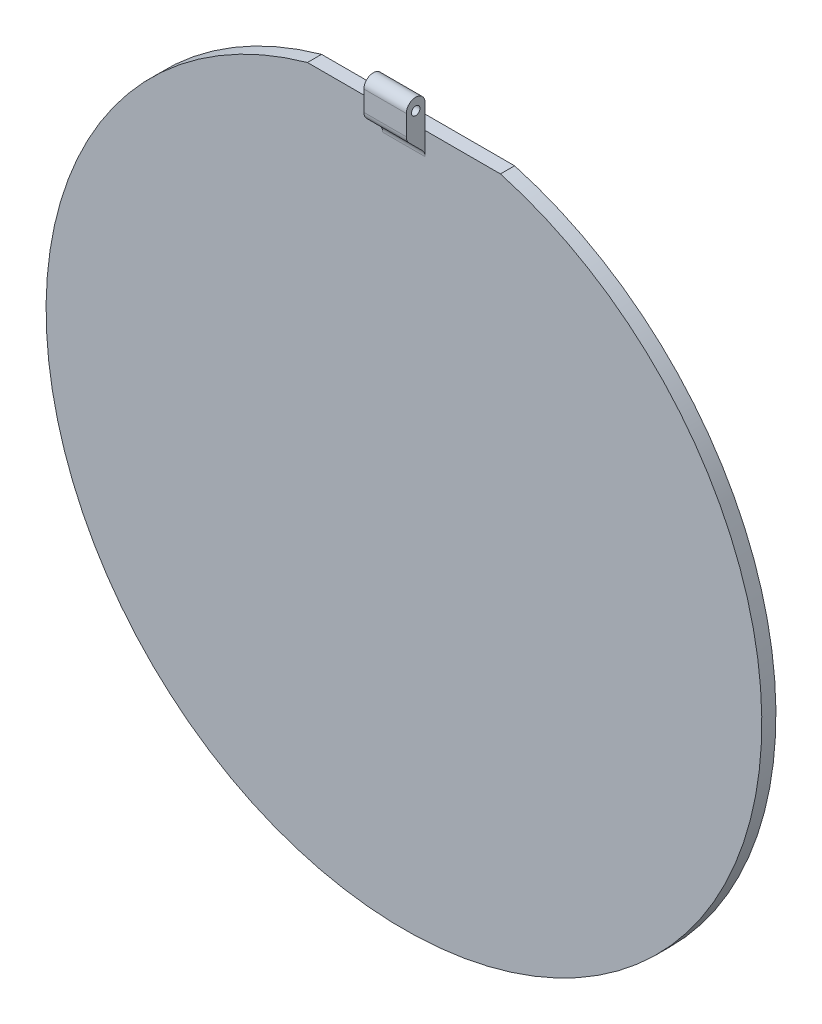
ISO-10303-21;
HEADER;
FILE_DESCRIPTION(('STEP AP214'),'2;1');
FILE_NAME('part.step','',(''),(''),'','','');
FILE_SCHEMA(('AUTOMOTIVE_DESIGN { 1 0 10303 214 1 1 1 1 }'));
ENDSEC;
DATA;
#1=APPLICATION_CONTEXT('core data for automotive mechanical design processes');
#2=APPLICATION_PROTOCOL_DEFINITION('international standard','automotive_design',2000,#1);
#3=PRODUCT_CONTEXT('',#1,'mechanical');
#4=PRODUCT('Part','Part','',(#3));
#5=PRODUCT_RELATED_PRODUCT_CATEGORY('part','',(#4));
#6=PRODUCT_DEFINITION_FORMATION('','',#4);
#7=PRODUCT_DEFINITION_CONTEXT('part definition',#1,'design');
#8=PRODUCT_DEFINITION('design','',#6,#7);
#9=PRODUCT_DEFINITION_SHAPE('','',#8);
#10=(LENGTH_UNIT() NAMED_UNIT(*) SI_UNIT(.MILLI.,.METRE.));
#11=(NAMED_UNIT(*) PLANE_ANGLE_UNIT() SI_UNIT($,.RADIAN.));
#12=(NAMED_UNIT(*) SI_UNIT($,.STERADIAN.) SOLID_ANGLE_UNIT());
#13=UNCERTAINTY_MEASURE_WITH_UNIT(LENGTH_MEASURE(1.E-05),#10,'distance_accuracy_value','');
#14=(GEOMETRIC_REPRESENTATION_CONTEXT(3) GLOBAL_UNCERTAINTY_ASSIGNED_CONTEXT((#13)) GLOBAL_UNIT_ASSIGNED_CONTEXT((#10,
#11,#12)) REPRESENTATION_CONTEXT('',''));
#15=CARTESIAN_POINT('',(0.,0.,0.));
#16=DIRECTION('',(0.,0.,1.));
#17=DIRECTION('',(1.,0.,0.));
#18=AXIS2_PLACEMENT_3D('',#15,#16,#17);
#19=CARTESIAN_POINT('',(2.25,39.1513595204169,2.5));
#20=DIRECTION('',(-1.,0.,0.));
#21=DIRECTION('',(0.,-1.,0.));
#22=AXIS2_PLACEMENT_3D('',#19,#20,#21);
#23=CYLINDRICAL_SURFACE('',#22,0.999999999999997);
#24=DIRECTION('',(1.,0.,0.));
#25=VECTOR('',#24,1.);
#26=CARTESIAN_POINT('',(2.25,39.1513595204169,3.5));
#27=LINE('',#26,#25);
#28=CARTESIAN_POINT('',(2.25,39.1513595204169,3.5));
#29=VERTEX_POINT('',#28);
#30=CARTESIAN_POINT('',(-2.25,39.1513595204169,3.5));
#31=VERTEX_POINT('',#30);
#32=EDGE_CURVE('E161',#29,#31,#27,.F.);
#33=ORIENTED_EDGE('',*,*,#32,.F.);
#34=CARTESIAN_POINT('',(2.25,39.1513595204169,2.5));
#35=DIRECTION('',(-1.,0.,0.));
#36=DIRECTION('',(0.,0.,1.));
#37=AXIS2_PLACEMENT_3D('',#34,#35,#36);
#38=CIRCLE('',#37,0.999999999999997);
#39=CARTESIAN_POINT('',(2.25,39.1513595204169,1.5));
#40=VERTEX_POINT('',#39);
#41=EDGE_CURVE('E167',#40,#29,#38,.F.);
#42=ORIENTED_EDGE('',*,*,#41,.F.);
#43=DIRECTION('',(-1.,0.,0.));
#44=VECTOR('',#43,1.);
#45=CARTESIAN_POINT('',(2.25,39.1513595204169,1.5));
#46=LINE('',#45,#44);
#47=CARTESIAN_POINT('',(-2.25,39.1513595204169,1.5));
#48=VERTEX_POINT('',#47);
#49=EDGE_CURVE('E116',#48,#40,#46,.F.);
#50=ORIENTED_EDGE('',*,*,#49,.F.);
#51=CARTESIAN_POINT('',(-2.25,39.1513595204169,2.5));
#52=DIRECTION('',(1.,0.,0.));
#53=DIRECTION('',(0.,1.,0.));
#54=AXIS2_PLACEMENT_3D('',#51,#52,#53);
#55=CIRCLE('',#54,0.999999999999997);
#56=EDGE_CURVE('E169',#31,#48,#55,.F.);
#57=ORIENTED_EDGE('',*,*,#56,.F.);
#58=EDGE_LOOP('',(#33,#42,#50,#57));
#59=FACE_BOUND('',#58,.T.);
#60=ADVANCED_FACE('F35',(#59),#23,.T.);
#61=CARTESIAN_POINT('',(-10.2470158263746,36.592330708142,-0.000999999999999916));
#62=DIRECTION('',(0.,-1.,0.));
#63=DIRECTION('',(0.,0.,-1.));
#64=AXIS2_PLACEMENT_3D('',#61,#62,#63);
#65=PLANE('',#64);
#66=DIRECTION('',(-1.,0.,0.));
#67=VECTOR('',#66,1.);
#68=CARTESIAN_POINT('',(2.25,36.592330708142,1.5));
#69=LINE('',#68,#67);
#70=CARTESIAN_POINT('',(2.25,36.592330708142,1.5));
#71=VERTEX_POINT('',#70);
#72=CARTESIAN_POINT('',(-2.25,36.592330708142,1.5));
#73=VERTEX_POINT('',#72);
#74=EDGE_CURVE('E113',#71,#73,#69,.T.);
#75=ORIENTED_EDGE('',*,*,#74,.F.);
#76=DIRECTION('',(1.,0.,0.));
#77=VECTOR('',#76,1.);
#78=CARTESIAN_POINT('',(-10.2470158263746,36.592330708142,1.5));
#79=LINE('',#78,#77);
#80=CARTESIAN_POINT('',(10.2470158263746,36.592330708142,1.5));
#81=VERTEX_POINT('',#80);
#82=EDGE_CURVE('E127',#71,#81,#79,.T.);
#83=ORIENTED_EDGE('',*,*,#82,.T.);
#84=DIRECTION('',(0.,0.,1.));
#85=VECTOR('',#84,1.);
#86=CARTESIAN_POINT('',(10.2470158263746,36.592330708142,-0.000999999999999916));
#87=LINE('',#86,#85);
#88=CARTESIAN_POINT('',(10.2470158263746,36.592330708142,0.));
#89=VERTEX_POINT('',#88);
#90=EDGE_CURVE('E154',#89,#81,#87,.T.);
#91=ORIENTED_EDGE('',*,*,#90,.F.);
#92=DIRECTION('',(-1.,0.,0.));
#93=VECTOR('',#92,1.);
#94=CARTESIAN_POINT('',(-10.2470158263746,36.592330708142,0.));
#95=LINE('',#94,#93);
#96=CARTESIAN_POINT('',(-10.2470158263746,36.592330708142,0.));
#97=VERTEX_POINT('',#96);
#98=EDGE_CURVE('E156',#89,#97,#95,.T.);
#99=ORIENTED_EDGE('',*,*,#98,.T.);
#100=DIRECTION('',(0.,0.,1.));
#101=VECTOR('',#100,1.);
#102=CARTESIAN_POINT('',(-10.2470158263746,36.592330708142,-0.000999999999999916));
#103=LINE('',#102,#101);
#104=CARTESIAN_POINT('',(-10.2470158263746,36.592330708142,1.5));
#105=VERTEX_POINT('',#104);
#106=EDGE_CURVE('E153',#97,#105,#103,.T.);
#107=ORIENTED_EDGE('',*,*,#106,.T.);
#108=EDGE_CURVE('E130',#105,#73,#79,.T.);
#109=ORIENTED_EDGE('',*,*,#108,.T.);
#110=EDGE_LOOP('',(#75,#83,#91,#99,#107,#109));
#111=FACE_BOUND('',#110,.T.);
#112=ADVANCED_FACE('F126',(#111),#65,.F.);
#113=CARTESIAN_POINT('',(0.,0.,1.5));
#114=DIRECTION('',(0.,0.,-1.));
#115=DIRECTION('',(-1.,0.,0.));
#116=AXIS2_PLACEMENT_3D('',#113,#114,#115);
#117=CYLINDRICAL_SURFACE('',#116,38.);
#118=CARTESIAN_POINT('',(0.,0.,1.5));
#119=DIRECTION('',(0.,0.,1.));
#120=DIRECTION('',(1.,0.,0.));
#121=AXIS2_PLACEMENT_3D('',#118,#119,#120);
#122=CIRCLE('',#121,38.);
#123=EDGE_CURVE('E139',#105,#81,#122,.T.);
#124=ORIENTED_EDGE('',*,*,#123,.F.);
#125=ORIENTED_EDGE('',*,*,#106,.F.);
#126=CARTESIAN_POINT('',(0.,0.,0.));
#127=DIRECTION('',(0.,0.,1.));
#128=DIRECTION('',(1.,0.,0.));
#129=AXIS2_PLACEMENT_3D('',#126,#127,#128);
#130=CIRCLE('',#129,38.);
#131=EDGE_CURVE('E159',#97,#89,#130,.T.);
#132=ORIENTED_EDGE('',*,*,#131,.T.);
#133=ORIENTED_EDGE('',*,*,#90,.T.);
#134=EDGE_LOOP('',(#124,#125,#132,#133));
#135=FACE_BOUND('',#134,.T.);
#136=ADVANCED_FACE('F216',(#135),#117,.T.);
#137=CARTESIAN_POINT('',(0.,0.,1.5));
#138=DIRECTION('',(0.,0.,1.));
#139=DIRECTION('',(1.,0.,0.));
#140=AXIS2_PLACEMENT_3D('',#137,#138,#139);
#141=PLANE('',#140);
#142=DIRECTION('',(0.,1.,0.));
#143=VECTOR('',#142,1.);
#144=CARTESIAN_POINT('',(2.25,36.592330708142,1.5));
#145=LINE('',#144,#143);
#146=CARTESIAN_POINT('',(2.25,34.1781171457689,1.5));
#147=VERTEX_POINT('',#146);
#148=EDGE_CURVE('E120',#147,#71,#145,.T.);
#149=ORIENTED_EDGE('',*,*,#148,.F.);
#150=DIRECTION('',(1.,0.,0.));
#151=VECTOR('',#150,1.);
#152=CARTESIAN_POINT('',(-2.25,34.1781171457689,1.5));
#153=LINE('',#152,#151);
#154=CARTESIAN_POINT('',(-2.25,34.1781171457689,1.5));
#155=VERTEX_POINT('',#154);
#156=EDGE_CURVE('E180',#147,#155,#153,.F.);
#157=ORIENTED_EDGE('',*,*,#156,.T.);
#158=DIRECTION('',(0.,-1.,0.));
#159=VECTOR('',#158,1.);
#160=CARTESIAN_POINT('',(-2.25,36.592330708142,1.5));
#161=LINE('',#160,#159);
#162=EDGE_CURVE('E146',#73,#155,#161,.T.);
#163=ORIENTED_EDGE('',*,*,#162,.F.);
#164=ORIENTED_EDGE('',*,*,#108,.F.);
#165=ORIENTED_EDGE('',*,*,#123,.T.);
#166=ORIENTED_EDGE('',*,*,#82,.F.);
#167=EDGE_LOOP('',(#149,#157,#163,#164,#165,#166));
#168=FACE_BOUND('',#167,.T.);
#169=ADVANCED_FACE('F135',(#168),#141,.T.);
#170=CARTESIAN_POINT('',(0.,0.,0.));
#171=DIRECTION('',(0.,0.,1.));
#172=DIRECTION('',(1.,0.,0.));
#173=AXIS2_PLACEMENT_3D('',#170,#171,#172);
#174=PLANE('',#173);
#175=ORIENTED_EDGE('',*,*,#131,.F.);
#176=ORIENTED_EDGE('',*,*,#98,.F.);
#177=EDGE_LOOP('',(#175,#176));
#178=FACE_BOUND('',#177,.T.);
#179=ADVANCED_FACE('F244',(#178),#174,.F.);
#180=CARTESIAN_POINT('',(2.25,36.592330708142,3.5));
#181=DIRECTION('',(-1.,0.,0.));
#182=DIRECTION('',(0.,0.,1.));
#183=AXIS2_PLACEMENT_3D('',#180,#181,#182);
#184=PLANE('',#183);
#185=CARTESIAN_POINT('',(2.25,38.8994820640522,2.5));
#186=DIRECTION('',(-1.,0.,0.));
#187=DIRECTION('',(0.,0.,1.));
#188=AXIS2_PLACEMENT_3D('',#185,#186,#187);
#189=CIRCLE('',#188,0.449999999999992);
#190=CARTESIAN_POINT('',(2.25,38.8994820640522,2.94999999999999));
#191=VERTEX_POINT('',#190);
#192=EDGE_CURVE('E131',#191,#191,#189,.T.);
#193=ORIENTED_EDGE('',*,*,#192,.T.);
#194=EDGE_LOOP('',(#193));
#195=FACE_BOUND('',#194,.T.);
#196=DIRECTION('',(0.,1.,0.));
#197=VECTOR('',#196,1.);
#198=CARTESIAN_POINT('',(2.25,36.592330708142,3.5));
#199=LINE('',#198,#197);
#200=CARTESIAN_POINT('',(2.25,37.0065442705151,3.5));
#201=VERTEX_POINT('',#200);
#202=EDGE_CURVE('E148',#201,#29,#199,.T.);
#203=ORIENTED_EDGE('',*,*,#202,.F.);
#204=CARTESIAN_POINT('',(2.25,37.0065442705151,2.5));
#205=DIRECTION('',(-1.,0.,0.));
#206=DIRECTION('',(0.,0.,1.));
#207=AXIS2_PLACEMENT_3D('',#204,#205,#206);
#208=CIRCLE('',#207,1.);
#209=CARTESIAN_POINT('',(2.25,36.2994374893285,3.20710678118655));
#210=VERTEX_POINT('',#209);
#211=EDGE_CURVE('E50',#201,#210,#208,.F.);
#212=ORIENTED_EDGE('',*,*,#211,.T.);
#213=DIRECTION('',(0.,-0.707106781186545,-0.70710678118655));
#214=VECTOR('',#213,1.);
#215=CARTESIAN_POINT('',(2.25,36.5923307081419,3.5));
#216=LINE('',#215,#214);
#217=CARTESIAN_POINT('',(2.25,34.8852239269554,1.79289321881346));
#218=VERTEX_POINT('',#217);
#219=EDGE_CURVE('E171',#210,#218,#216,.T.);
#220=ORIENTED_EDGE('',*,*,#219,.T.);
#221=CARTESIAN_POINT('',(2.25,34.1781171457689,2.5));
#222=DIRECTION('',(-1.,0.,0.));
#223=DIRECTION('',(0.,0.,1.));
#224=AXIS2_PLACEMENT_3D('',#221,#222,#223);
#225=CIRCLE('',#224,1.);
#226=EDGE_CURVE('E43',#218,#147,#225,.T.);
#227=ORIENTED_EDGE('',*,*,#226,.T.);
#228=ORIENTED_EDGE('',*,*,#148,.T.);
#229=DIRECTION('',(0.,-1.,0.));
#230=VECTOR('',#229,1.);
#231=CARTESIAN_POINT('',(2.25,45.1017890475389,1.5));
#232=LINE('',#231,#230);
#233=EDGE_CURVE('E109',#40,#71,#232,.T.);
#234=ORIENTED_EDGE('',*,*,#233,.F.);
#235=ORIENTED_EDGE('',*,*,#41,.T.);
#236=EDGE_LOOP('',(#203,#212,#220,#227,#228,#234,#235));
#237=FACE_BOUND('',#236,.T.);
#238=ADVANCED_FACE('F143',(#195,#237),#184,.F.);
#239=CARTESIAN_POINT('',(-2.25,36.592330708142,3.5));
#240=DIRECTION('',(1.,0.,0.));
#241=DIRECTION('',(0.,1.,0.));
#242=AXIS2_PLACEMENT_3D('',#239,#240,#241);
#243=PLANE('',#242);
#244=CARTESIAN_POINT('',(-2.25,38.8994820640522,2.5));
#245=DIRECTION('',(-1.,0.,0.));
#246=DIRECTION('',(0.,0.,1.));
#247=AXIS2_PLACEMENT_3D('',#244,#245,#246);
#248=CIRCLE('',#247,0.449999999999992);
#249=CARTESIAN_POINT('',(-2.25,38.8994820640522,2.94999999999999));
#250=VERTEX_POINT('',#249);
#251=EDGE_CURVE('E197',#250,#250,#248,.T.);
#252=ORIENTED_EDGE('',*,*,#251,.F.);
#253=EDGE_LOOP('',(#252));
#254=FACE_BOUND('',#253,.T.);
#255=DIRECTION('',(0.,0.707106781186545,0.70710678118655));
#256=VECTOR('',#255,1.);
#257=CARTESIAN_POINT('',(-2.25,36.5923307081419,3.5));
#258=LINE('',#257,#256);
#259=CARTESIAN_POINT('',(-2.25,34.8852239269554,1.79289321881346));
#260=VERTEX_POINT('',#259);
#261=CARTESIAN_POINT('',(-2.25,36.2994374893285,3.20710678118655));
#262=VERTEX_POINT('',#261);
#263=EDGE_CURVE('E173',#260,#262,#258,.T.);
#264=ORIENTED_EDGE('',*,*,#263,.T.);
#265=CARTESIAN_POINT('',(-2.25,37.0065442705151,2.5));
#266=DIRECTION('',(1.,0.,0.));
#267=DIRECTION('',(0.,1.,0.));
#268=AXIS2_PLACEMENT_3D('',#265,#266,#267);
#269=CIRCLE('',#268,1.);
#270=CARTESIAN_POINT('',(-2.25,37.0065442705151,3.5));
#271=VERTEX_POINT('',#270);
#272=EDGE_CURVE('E58',#262,#271,#269,.F.);
#273=ORIENTED_EDGE('',*,*,#272,.T.);
#274=DIRECTION('',(0.,-1.,0.));
#275=VECTOR('',#274,1.);
#276=CARTESIAN_POINT('',(-2.25,36.592330708142,3.5));
#277=LINE('',#276,#275);
#278=EDGE_CURVE('E140',#31,#271,#277,.T.);
#279=ORIENTED_EDGE('',*,*,#278,.F.);
#280=ORIENTED_EDGE('',*,*,#56,.T.);
#281=DIRECTION('',(0.,-1.,0.));
#282=VECTOR('',#281,1.);
#283=CARTESIAN_POINT('',(-2.25,45.1017890475389,1.5));
#284=LINE('',#283,#282);
#285=EDGE_CURVE('E121',#48,#73,#284,.T.);
#286=ORIENTED_EDGE('',*,*,#285,.T.);
#287=ORIENTED_EDGE('',*,*,#162,.T.);
#288=CARTESIAN_POINT('',(-2.25,34.1781171457689,2.5));
#289=DIRECTION('',(1.,0.,0.));
#290=DIRECTION('',(0.,1.,0.));
#291=AXIS2_PLACEMENT_3D('',#288,#289,#290);
#292=CIRCLE('',#291,1.);
#293=EDGE_CURVE('E11',#155,#260,#292,.T.);
#294=ORIENTED_EDGE('',*,*,#293,.T.);
#295=EDGE_LOOP('',(#264,#273,#279,#280,#286,#287,#294));
#296=FACE_BOUND('',#295,.T.);
#297=ADVANCED_FACE('F204',(#254,#296),#243,.F.);
#298=CARTESIAN_POINT('',(0.,0.,3.5));
#299=DIRECTION('',(0.,0.,1.));
#300=DIRECTION('',(1.,0.,0.));
#301=AXIS2_PLACEMENT_3D('',#298,#299,#300);
#302=PLANE('',#301);
#303=ORIENTED_EDGE('',*,*,#278,.T.);
#304=DIRECTION('',(1.,0.,0.));
#305=VECTOR('',#304,1.);
#306=CARTESIAN_POINT('',(0.,37.0065442705151,3.5));
#307=LINE('',#306,#305);
#308=EDGE_CURVE('E182',#271,#201,#307,.T.);
#309=ORIENTED_EDGE('',*,*,#308,.T.);
#310=ORIENTED_EDGE('',*,*,#202,.T.);
#311=ORIENTED_EDGE('',*,*,#32,.T.);
#312=EDGE_LOOP('',(#303,#309,#310,#311));
#313=FACE_BOUND('',#312,.T.);
#314=ADVANCED_FACE('F191',(#313),#302,.T.);
#315=CARTESIAN_POINT('',(2.25,45.1017890475389,1.5));
#316=DIRECTION('',(0.,0.,1.));
#317=DIRECTION('',(1.,0.,0.));
#318=AXIS2_PLACEMENT_3D('',#315,#316,#317);
#319=PLANE('',#318);
#320=ORIENTED_EDGE('',*,*,#285,.F.);
#321=ORIENTED_EDGE('',*,*,#49,.T.);
#322=ORIENTED_EDGE('',*,*,#233,.T.);
#323=ORIENTED_EDGE('',*,*,#74,.T.);
#324=EDGE_LOOP('',(#320,#321,#322,#323));
#325=FACE_BOUND('',#324,.T.);
#326=ADVANCED_FACE('F112',(#325),#319,.F.);
#327=CARTESIAN_POINT('',(0.,36.5923307081419,3.5));
#328=DIRECTION('',(0.,-0.70710678118655,0.707106781186545));
#329=DIRECTION('',(-1.,0.,0.));
#330=AXIS2_PLACEMENT_3D('',#327,#328,#329);
#331=PLANE('',#330);
#332=ORIENTED_EDGE('',*,*,#263,.F.);
#333=DIRECTION('',(1.,0.,0.));
#334=VECTOR('',#333,1.);
#335=CARTESIAN_POINT('',(2.25,34.8852239269554,1.79289321881345));
#336=LINE('',#335,#334);
#337=EDGE_CURVE('E177',#260,#218,#336,.T.);
#338=ORIENTED_EDGE('',*,*,#337,.T.);
#339=ORIENTED_EDGE('',*,*,#219,.F.);
#340=DIRECTION('',(1.,0.,0.));
#341=VECTOR('',#340,1.);
#342=CARTESIAN_POINT('',(0.,36.2994374893285,3.20710678118655));
#343=LINE('',#342,#341);
#344=EDGE_CURVE('E175',#210,#262,#343,.F.);
#345=ORIENTED_EDGE('',*,*,#344,.T.);
#346=EDGE_LOOP('',(#332,#338,#339,#345));
#347=FACE_BOUND('',#346,.T.);
#348=ADVANCED_FACE('F188',(#347),#331,.T.);
#349=CARTESIAN_POINT('',(0.,34.1781171457689,2.5));
#350=DIRECTION('',(-1.,0.,0.));
#351=DIRECTION('',(0.,0.,1.));
#352=AXIS2_PLACEMENT_3D('',#349,#350,#351);
#353=CYLINDRICAL_SURFACE('',#352,1.);
#354=ORIENTED_EDGE('',*,*,#293,.F.);
#355=ORIENTED_EDGE('',*,*,#156,.F.);
#356=ORIENTED_EDGE('',*,*,#226,.F.);
#357=ORIENTED_EDGE('',*,*,#337,.F.);
#358=EDGE_LOOP('',(#354,#355,#356,#357));
#359=FACE_BOUND('',#358,.T.);
#360=ADVANCED_FACE('F209',(#359),#353,.F.);
#361=CARTESIAN_POINT('',(0.,37.0065442705151,2.5));
#362=DIRECTION('',(1.,0.,0.));
#363=DIRECTION('',(0.,0.,-1.));
#364=AXIS2_PLACEMENT_3D('',#361,#362,#363);
#365=CYLINDRICAL_SURFACE('',#364,1.);
#366=ORIENTED_EDGE('',*,*,#272,.F.);
#367=ORIENTED_EDGE('',*,*,#344,.F.);
#368=ORIENTED_EDGE('',*,*,#211,.F.);
#369=ORIENTED_EDGE('',*,*,#308,.F.);
#370=EDGE_LOOP('',(#366,#367,#368,#369));
#371=FACE_BOUND('',#370,.T.);
#372=ADVANCED_FACE('F37',(#371),#365,.T.);
#373=CARTESIAN_POINT('',(-2.25,38.8994820640522,2.5));
#374=DIRECTION('',(-1.,0.,0.));
#375=DIRECTION('',(0.,0.,1.));
#376=AXIS2_PLACEMENT_3D('',#373,#374,#375);
#377=CYLINDRICAL_SURFACE('',#376,0.449999999999992);
#378=ORIENTED_EDGE('',*,*,#251,.T.);
#379=EDGE_LOOP('',(#378));
#380=FACE_BOUND('',#379,.T.);
#381=ORIENTED_EDGE('',*,*,#192,.F.);
#382=EDGE_LOOP('',(#381));
#383=FACE_BOUND('',#382,.T.);
#384=ADVANCED_FACE('F201',(#380,#383),#377,.F.);
#385=CLOSED_SHELL('',(#60,#112,#136,#169,#179,#238,#297,#314,#326,#348,#360,#372,#384));
#386=MANIFOLD_SOLID_BREP('B2',#385);
#387=ADVANCED_BREP_SHAPE_REPRESENTATION('',(#18,#386),#14);
#388=SHAPE_DEFINITION_REPRESENTATION(#9,#387);
ENDSEC;
END-ISO-10303-21;
